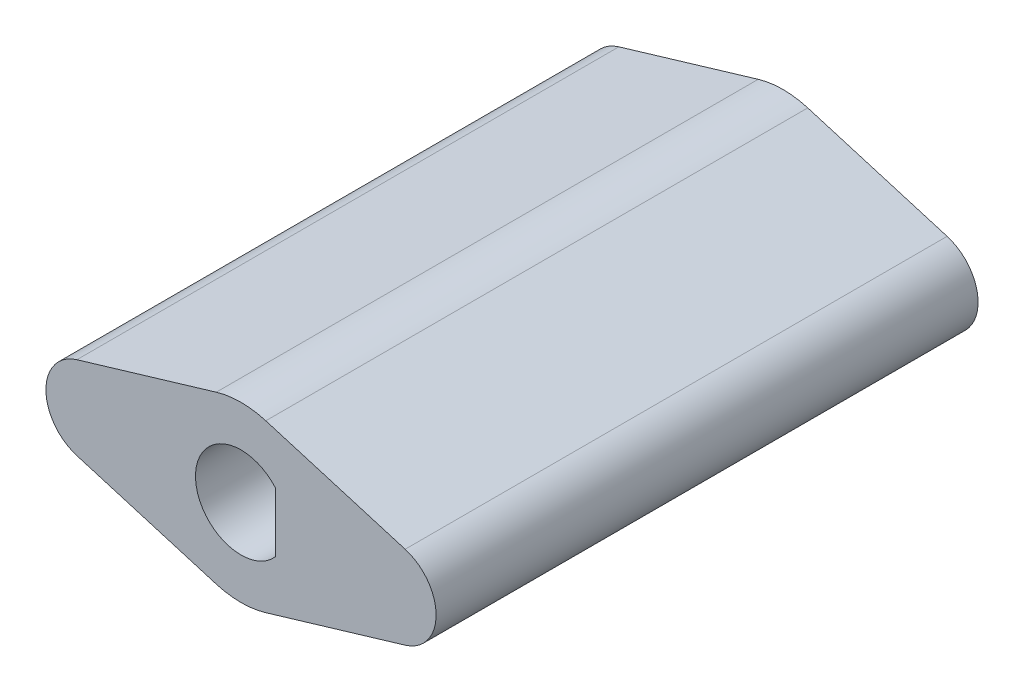
ISO-10303-21;
HEADER;
FILE_DESCRIPTION(('STEP AP214'),'2;1');
FILE_NAME('part.step','',(''),(''),'','','');
FILE_SCHEMA(('AUTOMOTIVE_DESIGN { 1 0 10303 214 1 1 1 1 }'));
ENDSEC;
DATA;
#1=APPLICATION_CONTEXT('core data for automotive mechanical design processes');
#2=APPLICATION_PROTOCOL_DEFINITION('international standard','automotive_design',2000,#1);
#3=PRODUCT_CONTEXT('',#1,'mechanical');
#4=PRODUCT('Part','Part','',(#3));
#5=PRODUCT_RELATED_PRODUCT_CATEGORY('part','',(#4));
#6=PRODUCT_DEFINITION_FORMATION('','',#4);
#7=PRODUCT_DEFINITION_CONTEXT('part definition',#1,'design');
#8=PRODUCT_DEFINITION('design','',#6,#7);
#9=PRODUCT_DEFINITION_SHAPE('','',#8);
#10=(LENGTH_UNIT() NAMED_UNIT(*) SI_UNIT(.MILLI.,.METRE.));
#11=(NAMED_UNIT(*) PLANE_ANGLE_UNIT() SI_UNIT($,.RADIAN.));
#12=(NAMED_UNIT(*) SI_UNIT($,.STERADIAN.) SOLID_ANGLE_UNIT());
#13=UNCERTAINTY_MEASURE_WITH_UNIT(LENGTH_MEASURE(1.E-05),#10,'distance_accuracy_value','');
#14=(GEOMETRIC_REPRESENTATION_CONTEXT(3) GLOBAL_UNCERTAINTY_ASSIGNED_CONTEXT((#13)) GLOBAL_UNIT_ASSIGNED_CONTEXT((#10,
#11,#12)) REPRESENTATION_CONTEXT('',''));
#15=CARTESIAN_POINT('',(0.,0.,0.));
#16=DIRECTION('',(0.,0.,1.));
#17=DIRECTION('',(1.,0.,0.));
#18=AXIS2_PLACEMENT_3D('',#15,#16,#17);
#19=CARTESIAN_POINT('',(-8.89,0.,15.875));
#20=DIRECTION('',(0.,0.,1.));
#21=DIRECTION('',(1.,0.,0.));
#22=AXIS2_PLACEMENT_3D('',#19,#20,#21);
#23=PLANE('',#22);
#24=CARTESIAN_POINT('',(-8.89,0.,15.875));
#25=DIRECTION('',(0.,0.,1.));
#26=DIRECTION('',(1.,0.,0.));
#27=AXIS2_PLACEMENT_3D('',#24,#25,#26);
#28=CIRCLE('',#27,2.54);
#29=CARTESIAN_POINT('',(-9.61571428571428,2.43411971264977,15.875));
#30=VERTEX_POINT('',#29);
#31=CARTESIAN_POINT('',(-9.61571428571429,-2.43411971264977,15.875));
#32=VERTEX_POINT('',#31);
#33=EDGE_CURVE('E126',#30,#32,#28,.T.);
#34=ORIENTED_EDGE('',*,*,#33,.T.);
#35=DIRECTION('',(0.95831484749991,-0.285714285714286,0.));
#36=VECTOR('',#35,1.);
#37=CARTESIAN_POINT('',(-9.61571428571429,-2.43411971264977,15.875));
#38=LINE('',#37,#36);
#39=CARTESIAN_POINT('',(-1.45142857142857,-4.86823942529954,15.875));
#40=VERTEX_POINT('',#39);
#41=EDGE_CURVE('E129',#32,#40,#38,.T.);
#42=ORIENTED_EDGE('',*,*,#41,.T.);
#43=CARTESIAN_POINT('',(0.,0.,15.875));
#44=DIRECTION('',(0.,0.,1.));
#45=DIRECTION('',(1.,0.,0.));
#46=AXIS2_PLACEMENT_3D('',#43,#44,#45);
#47=CIRCLE('',#46,5.08);
#48=CARTESIAN_POINT('',(1.45142857142857,-4.86823942529954,15.875));
#49=VERTEX_POINT('',#48);
#50=EDGE_CURVE('E132',#40,#49,#47,.T.);
#51=ORIENTED_EDGE('',*,*,#50,.T.);
#52=DIRECTION('',(0.95831484749991,0.285714285714285,0.));
#53=VECTOR('',#52,1.);
#54=CARTESIAN_POINT('',(9.61571428571428,-2.43411971264977,15.875));
#55=LINE('',#54,#53);
#56=CARTESIAN_POINT('',(9.61571428571428,-2.43411971264977,15.875));
#57=VERTEX_POINT('',#56);
#58=EDGE_CURVE('E134',#49,#57,#55,.T.);
#59=ORIENTED_EDGE('',*,*,#58,.T.);
#60=CARTESIAN_POINT('',(8.89,0.,15.875));
#61=DIRECTION('',(0.,0.,1.));
#62=DIRECTION('',(1.,0.,0.));
#63=AXIS2_PLACEMENT_3D('',#60,#61,#62);
#64=CIRCLE('',#63,2.54);
#65=CARTESIAN_POINT('',(9.61571428571428,2.43411971264977,15.875));
#66=VERTEX_POINT('',#65);
#67=EDGE_CURVE('E136',#57,#66,#64,.T.);
#68=ORIENTED_EDGE('',*,*,#67,.T.);
#69=DIRECTION('',(-0.95831484749991,0.285714285714285,0.));
#70=VECTOR('',#69,1.);
#71=CARTESIAN_POINT('',(9.61571428571428,2.43411971264977,15.875));
#72=LINE('',#71,#70);
#73=CARTESIAN_POINT('',(1.45142857142857,4.86823942529954,15.875));
#74=VERTEX_POINT('',#73);
#75=EDGE_CURVE('E138',#66,#74,#72,.T.);
#76=ORIENTED_EDGE('',*,*,#75,.T.);
#77=CARTESIAN_POINT('',(0.,0.,15.875));
#78=DIRECTION('',(0.,0.,1.));
#79=DIRECTION('',(1.,0.,0.));
#80=AXIS2_PLACEMENT_3D('',#77,#78,#79);
#81=CIRCLE('',#80,5.08);
#82=CARTESIAN_POINT('',(-1.45142857142857,4.86823942529954,15.875));
#83=VERTEX_POINT('',#82);
#84=EDGE_CURVE('E140',#74,#83,#81,.T.);
#85=ORIENTED_EDGE('',*,*,#84,.T.);
#86=DIRECTION('',(-0.95831484749991,-0.285714285714286,0.));
#87=VECTOR('',#86,1.);
#88=CARTESIAN_POINT('',(-9.61571428571428,2.43411971264977,15.875));
#89=LINE('',#88,#87);
#90=EDGE_CURVE('E142',#83,#30,#89,.T.);
#91=ORIENTED_EDGE('',*,*,#90,.T.);
#92=EDGE_LOOP('',(#34,#42,#51,#59,#68,#76,#85,#91));
#93=FACE_BOUND('',#92,.T.);
#94=DIRECTION('',(0.,1.,0.));
#95=VECTOR('',#94,1.);
#96=CARTESIAN_POINT('',(2.032,1.7273867546094,15.875));
#97=LINE('',#96,#95);
#98=CARTESIAN_POINT('',(2.032,-1.7273867546094,15.875));
#99=VERTEX_POINT('',#98);
#100=CARTESIAN_POINT('',(2.032,1.7273867546094,15.875));
#101=VERTEX_POINT('',#100);
#102=EDGE_CURVE('E109',#99,#101,#97,.T.);
#103=ORIENTED_EDGE('',*,*,#102,.F.);
#104=CARTESIAN_POINT('',(0.,0.,15.875));
#105=DIRECTION('',(0.,0.,1.));
#106=DIRECTION('',(1.,0.,0.));
#107=AXIS2_PLACEMENT_3D('',#104,#105,#106);
#108=CIRCLE('',#107,2.667);
#109=EDGE_CURVE('E115',#101,#99,#108,.T.);
#110=ORIENTED_EDGE('',*,*,#109,.F.);
#111=EDGE_LOOP('',(#103,#110));
#112=FACE_BOUND('',#111,.T.);
#113=ADVANCED_FACE('F33',(#93,#112),#23,.T.);
#114=CARTESIAN_POINT('',(-8.89,0.,-15.875));
#115=DIRECTION('',(0.,0.,1.));
#116=DIRECTION('',(1.,0.,0.));
#117=AXIS2_PLACEMENT_3D('',#114,#115,#116);
#118=PLANE('',#117);
#119=CARTESIAN_POINT('',(-8.89,0.,-15.875));
#120=DIRECTION('',(0.,0.,1.));
#121=DIRECTION('',(1.,0.,0.));
#122=AXIS2_PLACEMENT_3D('',#119,#120,#121);
#123=CIRCLE('',#122,2.54);
#124=CARTESIAN_POINT('',(-9.61571428571428,2.43411971264977,-15.875));
#125=VERTEX_POINT('',#124);
#126=CARTESIAN_POINT('',(-9.61571428571429,-2.43411971264977,-15.875));
#127=VERTEX_POINT('',#126);
#128=EDGE_CURVE('E125',#125,#127,#123,.T.);
#129=ORIENTED_EDGE('',*,*,#128,.F.);
#130=DIRECTION('',(-0.95831484749991,-0.285714285714286,0.));
#131=VECTOR('',#130,1.);
#132=CARTESIAN_POINT('',(-9.61571428571428,2.43411971264977,-15.875));
#133=LINE('',#132,#131);
#134=CARTESIAN_POINT('',(-1.45142857142857,4.86823942529954,-15.875));
#135=VERTEX_POINT('',#134);
#136=EDGE_CURVE('E130',#135,#125,#133,.T.);
#137=ORIENTED_EDGE('',*,*,#136,.F.);
#138=CARTESIAN_POINT('',(0.,0.,-15.875));
#139=DIRECTION('',(0.,0.,1.));
#140=DIRECTION('',(1.,0.,0.));
#141=AXIS2_PLACEMENT_3D('',#138,#139,#140);
#142=CIRCLE('',#141,5.08);
#143=CARTESIAN_POINT('',(1.45142857142857,4.86823942529954,-15.875));
#144=VERTEX_POINT('',#143);
#145=EDGE_CURVE('E157',#144,#135,#142,.T.);
#146=ORIENTED_EDGE('',*,*,#145,.F.);
#147=DIRECTION('',(-0.95831484749991,0.285714285714285,0.));
#148=VECTOR('',#147,1.);
#149=CARTESIAN_POINT('',(9.61571428571428,2.43411971264977,-15.875));
#150=LINE('',#149,#148);
#151=CARTESIAN_POINT('',(9.61571428571428,2.43411971264977,-15.875));
#152=VERTEX_POINT('',#151);
#153=EDGE_CURVE('E155',#152,#144,#150,.T.);
#154=ORIENTED_EDGE('',*,*,#153,.F.);
#155=CARTESIAN_POINT('',(8.89,0.,-15.875));
#156=DIRECTION('',(0.,0.,1.));
#157=DIRECTION('',(1.,0.,0.));
#158=AXIS2_PLACEMENT_3D('',#155,#156,#157);
#159=CIRCLE('',#158,2.54);
#160=CARTESIAN_POINT('',(9.61571428571428,-2.43411971264977,-15.875));
#161=VERTEX_POINT('',#160);
#162=EDGE_CURVE('E153',#161,#152,#159,.T.);
#163=ORIENTED_EDGE('',*,*,#162,.F.);
#164=DIRECTION('',(0.95831484749991,0.285714285714285,0.));
#165=VECTOR('',#164,1.);
#166=CARTESIAN_POINT('',(9.61571428571428,-2.43411971264977,-15.875));
#167=LINE('',#166,#165);
#168=CARTESIAN_POINT('',(1.45142857142857,-4.86823942529954,-15.875));
#169=VERTEX_POINT('',#168);
#170=EDGE_CURVE('E151',#169,#161,#167,.T.);
#171=ORIENTED_EDGE('',*,*,#170,.F.);
#172=CARTESIAN_POINT('',(0.,0.,-15.875));
#173=DIRECTION('',(0.,0.,1.));
#174=DIRECTION('',(1.,0.,0.));
#175=AXIS2_PLACEMENT_3D('',#172,#173,#174);
#176=CIRCLE('',#175,5.08);
#177=CARTESIAN_POINT('',(-1.45142857142857,-4.86823942529954,-15.875));
#178=VERTEX_POINT('',#177);
#179=EDGE_CURVE('E149',#178,#169,#176,.T.);
#180=ORIENTED_EDGE('',*,*,#179,.F.);
#181=DIRECTION('',(0.95831484749991,-0.285714285714286,0.));
#182=VECTOR('',#181,1.);
#183=CARTESIAN_POINT('',(-9.61571428571429,-2.43411971264977,-15.875));
#184=LINE('',#183,#182);
#185=EDGE_CURVE('E147',#127,#178,#184,.T.);
#186=ORIENTED_EDGE('',*,*,#185,.F.);
#187=EDGE_LOOP('',(#129,#137,#146,#154,#163,#171,#180,#186));
#188=FACE_BOUND('',#187,.T.);
#189=CARTESIAN_POINT('',(0.,0.,-15.875));
#190=DIRECTION('',(0.,0.,1.));
#191=DIRECTION('',(1.,0.,0.));
#192=AXIS2_PLACEMENT_3D('',#189,#190,#191);
#193=CIRCLE('',#192,2.667);
#194=CARTESIAN_POINT('',(2.032,1.7273867546094,-15.875));
#195=VERTEX_POINT('',#194);
#196=CARTESIAN_POINT('',(2.032,-1.7273867546094,-15.875));
#197=VERTEX_POINT('',#196);
#198=EDGE_CURVE('E55',#195,#197,#193,.T.);
#199=ORIENTED_EDGE('',*,*,#198,.T.);
#200=DIRECTION('',(0.,1.,0.));
#201=VECTOR('',#200,1.);
#202=CARTESIAN_POINT('',(2.032,1.7273867546094,-15.875));
#203=LINE('',#202,#201);
#204=EDGE_CURVE('E119',#197,#195,#203,.T.);
#205=ORIENTED_EDGE('',*,*,#204,.T.);
#206=EDGE_LOOP('',(#199,#205));
#207=FACE_BOUND('',#206,.T.);
#208=ADVANCED_FACE('F187',(#188,#207),#118,.F.);
#209=CARTESIAN_POINT('',(-8.89,0.,15.875));
#210=DIRECTION('',(0.,0.,-1.));
#211=DIRECTION('',(-1.,0.,0.));
#212=AXIS2_PLACEMENT_3D('',#209,#210,#211);
#213=CYLINDRICAL_SURFACE('',#212,2.54);
#214=ORIENTED_EDGE('',*,*,#128,.T.);
#215=DIRECTION('',(0.,0.,-1.));
#216=VECTOR('',#215,1.);
#217=CARTESIAN_POINT('',(-9.61571428571429,-2.43411971264977,15.875));
#218=LINE('',#217,#216);
#219=EDGE_CURVE('E11',#32,#127,#218,.T.);
#220=ORIENTED_EDGE('',*,*,#219,.F.);
#221=ORIENTED_EDGE('',*,*,#33,.F.);
#222=DIRECTION('',(0.,0.,-1.));
#223=VECTOR('',#222,1.);
#224=CARTESIAN_POINT('',(-9.61571428571428,2.43411971264977,15.875));
#225=LINE('',#224,#223);
#226=EDGE_CURVE('E144',#30,#125,#225,.T.);
#227=ORIENTED_EDGE('',*,*,#226,.T.);
#228=EDGE_LOOP('',(#214,#220,#221,#227));
#229=FACE_BOUND('',#228,.T.);
#230=ADVANCED_FACE('F35',(#229),#213,.T.);
#231=CARTESIAN_POINT('',(-9.61571428571429,-2.43411971264977,15.875));
#232=DIRECTION('',(0.285714285714286,0.95831484749991,0.));
#233=DIRECTION('',(-0.95831484749991,0.285714285714286,0.));
#234=AXIS2_PLACEMENT_3D('',#231,#232,#233);
#235=PLANE('',#234);
#236=ORIENTED_EDGE('',*,*,#185,.T.);
#237=DIRECTION('',(0.,0.,-1.));
#238=VECTOR('',#237,1.);
#239=CARTESIAN_POINT('',(-1.45142857142857,-4.86823942529954,15.875));
#240=LINE('',#239,#238);
#241=EDGE_CURVE('E41',#40,#178,#240,.T.);
#242=ORIENTED_EDGE('',*,*,#241,.F.);
#243=ORIENTED_EDGE('',*,*,#41,.F.);
#244=ORIENTED_EDGE('',*,*,#219,.T.);
#245=EDGE_LOOP('',(#236,#242,#243,#244));
#246=FACE_BOUND('',#245,.T.);
#247=ADVANCED_FACE('F204',(#246),#235,.F.);
#248=CARTESIAN_POINT('',(0.,0.,15.875));
#249=DIRECTION('',(0.,0.,-1.));
#250=DIRECTION('',(-1.,0.,0.));
#251=AXIS2_PLACEMENT_3D('',#248,#249,#250);
#252=CYLINDRICAL_SURFACE('',#251,5.08);
#253=ORIENTED_EDGE('',*,*,#179,.T.);
#254=DIRECTION('',(0.,0.,-1.));
#255=VECTOR('',#254,1.);
#256=CARTESIAN_POINT('',(1.45142857142857,-4.86823942529954,15.875));
#257=LINE('',#256,#255);
#258=EDGE_CURVE('E174',#49,#169,#257,.T.);
#259=ORIENTED_EDGE('',*,*,#258,.F.);
#260=ORIENTED_EDGE('',*,*,#50,.F.);
#261=ORIENTED_EDGE('',*,*,#241,.T.);
#262=EDGE_LOOP('',(#253,#259,#260,#261));
#263=FACE_BOUND('',#262,.T.);
#264=ADVANCED_FACE('F181',(#263),#252,.T.);
#265=CARTESIAN_POINT('',(9.61571428571428,-2.43411971264977,15.875));
#266=DIRECTION('',(-0.285714285714285,0.95831484749991,0.));
#267=DIRECTION('',(-0.95831484749991,-0.285714285714285,0.));
#268=AXIS2_PLACEMENT_3D('',#265,#266,#267);
#269=PLANE('',#268);
#270=ORIENTED_EDGE('',*,*,#170,.T.);
#271=DIRECTION('',(0.,0.,-1.));
#272=VECTOR('',#271,1.);
#273=CARTESIAN_POINT('',(9.61571428571428,-2.43411971264977,15.875));
#274=LINE('',#273,#272);
#275=EDGE_CURVE('E171',#57,#161,#274,.T.);
#276=ORIENTED_EDGE('',*,*,#275,.F.);
#277=ORIENTED_EDGE('',*,*,#58,.F.);
#278=ORIENTED_EDGE('',*,*,#258,.T.);
#279=EDGE_LOOP('',(#270,#276,#277,#278));
#280=FACE_BOUND('',#279,.T.);
#281=ADVANCED_FACE('F193',(#280),#269,.F.);
#282=CARTESIAN_POINT('',(8.89,0.,15.875));
#283=DIRECTION('',(0.,0.,-1.));
#284=DIRECTION('',(-1.,0.,0.));
#285=AXIS2_PLACEMENT_3D('',#282,#283,#284);
#286=CYLINDRICAL_SURFACE('',#285,2.54);
#287=ORIENTED_EDGE('',*,*,#162,.T.);
#288=DIRECTION('',(0.,0.,-1.));
#289=VECTOR('',#288,1.);
#290=CARTESIAN_POINT('',(9.61571428571428,2.43411971264977,15.875));
#291=LINE('',#290,#289);
#292=EDGE_CURVE('E168',#66,#152,#291,.T.);
#293=ORIENTED_EDGE('',*,*,#292,.F.);
#294=ORIENTED_EDGE('',*,*,#67,.F.);
#295=ORIENTED_EDGE('',*,*,#275,.T.);
#296=EDGE_LOOP('',(#287,#293,#294,#295));
#297=FACE_BOUND('',#296,.T.);
#298=ADVANCED_FACE('F197',(#297),#286,.T.);
#299=CARTESIAN_POINT('',(9.61571428571428,2.43411971264977,15.875));
#300=DIRECTION('',(-0.285714285714285,-0.95831484749991,0.));
#301=DIRECTION('',(0.95831484749991,-0.285714285714285,0.));
#302=AXIS2_PLACEMENT_3D('',#299,#300,#301);
#303=PLANE('',#302);
#304=ORIENTED_EDGE('',*,*,#153,.T.);
#305=DIRECTION('',(0.,0.,-1.));
#306=VECTOR('',#305,1.);
#307=CARTESIAN_POINT('',(1.45142857142857,4.86823942529954,15.875));
#308=LINE('',#307,#306);
#309=EDGE_CURVE('E165',#74,#144,#308,.T.);
#310=ORIENTED_EDGE('',*,*,#309,.F.);
#311=ORIENTED_EDGE('',*,*,#75,.F.);
#312=ORIENTED_EDGE('',*,*,#292,.T.);
#313=EDGE_LOOP('',(#304,#310,#311,#312));
#314=FACE_BOUND('',#313,.T.);
#315=ADVANCED_FACE('F217',(#314),#303,.F.);
#316=CARTESIAN_POINT('',(0.,0.,15.875));
#317=DIRECTION('',(0.,0.,-1.));
#318=DIRECTION('',(-1.,0.,0.));
#319=AXIS2_PLACEMENT_3D('',#316,#317,#318);
#320=CYLINDRICAL_SURFACE('',#319,5.08);
#321=ORIENTED_EDGE('',*,*,#145,.T.);
#322=DIRECTION('',(0.,0.,-1.));
#323=VECTOR('',#322,1.);
#324=CARTESIAN_POINT('',(-1.45142857142857,4.86823942529954,15.875));
#325=LINE('',#324,#323);
#326=EDGE_CURVE('E162',#83,#135,#325,.T.);
#327=ORIENTED_EDGE('',*,*,#326,.F.);
#328=ORIENTED_EDGE('',*,*,#84,.F.);
#329=ORIENTED_EDGE('',*,*,#309,.T.);
#330=EDGE_LOOP('',(#321,#327,#328,#329));
#331=FACE_BOUND('',#330,.T.);
#332=ADVANCED_FACE('F215',(#331),#320,.T.);
#333=CARTESIAN_POINT('',(-9.61571428571428,2.43411971264977,15.875));
#334=DIRECTION('',(0.285714285714286,-0.95831484749991,0.));
#335=DIRECTION('',(0.95831484749991,0.285714285714286,0.));
#336=AXIS2_PLACEMENT_3D('',#333,#334,#335);
#337=PLANE('',#336);
#338=ORIENTED_EDGE('',*,*,#136,.T.);
#339=ORIENTED_EDGE('',*,*,#226,.F.);
#340=ORIENTED_EDGE('',*,*,#90,.F.);
#341=ORIENTED_EDGE('',*,*,#326,.T.);
#342=EDGE_LOOP('',(#338,#339,#340,#341));
#343=FACE_BOUND('',#342,.T.);
#344=ADVANCED_FACE('F210',(#343),#337,.F.);
#345=CARTESIAN_POINT('',(0.,0.,15.875));
#346=DIRECTION('',(0.,0.,-1.));
#347=DIRECTION('',(-1.,0.,0.));
#348=AXIS2_PLACEMENT_3D('',#345,#346,#347);
#349=CYLINDRICAL_SURFACE('',#348,2.667);
#350=ORIENTED_EDGE('',*,*,#198,.F.);
#351=DIRECTION('',(0.,0.,-1.));
#352=VECTOR('',#351,1.);
#353=CARTESIAN_POINT('',(2.032,1.7273867546094,15.875));
#354=LINE('',#353,#352);
#355=EDGE_CURVE('E111',#101,#195,#354,.T.);
#356=ORIENTED_EDGE('',*,*,#355,.F.);
#357=ORIENTED_EDGE('',*,*,#109,.T.);
#358=DIRECTION('',(0.,0.,-1.));
#359=VECTOR('',#358,1.);
#360=CARTESIAN_POINT('',(2.032,-1.7273867546094,15.875));
#361=LINE('',#360,#359);
#362=EDGE_CURVE('E48',#99,#197,#361,.T.);
#363=ORIENTED_EDGE('',*,*,#362,.T.);
#364=EDGE_LOOP('',(#350,#356,#357,#363));
#365=FACE_BOUND('',#364,.T.);
#366=ADVANCED_FACE('F117',(#365),#349,.F.);
#367=CARTESIAN_POINT('',(2.032,1.7273867546094,15.875));
#368=DIRECTION('',(-1.,0.,0.));
#369=DIRECTION('',(0.,0.,1.));
#370=AXIS2_PLACEMENT_3D('',#367,#368,#369);
#371=PLANE('',#370);
#372=ORIENTED_EDGE('',*,*,#204,.F.);
#373=ORIENTED_EDGE('',*,*,#362,.F.);
#374=ORIENTED_EDGE('',*,*,#102,.T.);
#375=ORIENTED_EDGE('',*,*,#355,.T.);
#376=EDGE_LOOP('',(#372,#373,#374,#375));
#377=FACE_BOUND('',#376,.T.);
#378=ADVANCED_FACE('F110',(#377),#371,.T.);
#379=CLOSED_SHELL('',(#113,#208,#230,#247,#264,#281,#298,#315,#332,#344,#366,#378));
#380=MANIFOLD_SOLID_BREP('B2',#379);
#381=ADVANCED_BREP_SHAPE_REPRESENTATION('',(#18,#380),#14);
#382=SHAPE_DEFINITION_REPRESENTATION(#9,#381);
ENDSEC;
END-ISO-10303-21;
